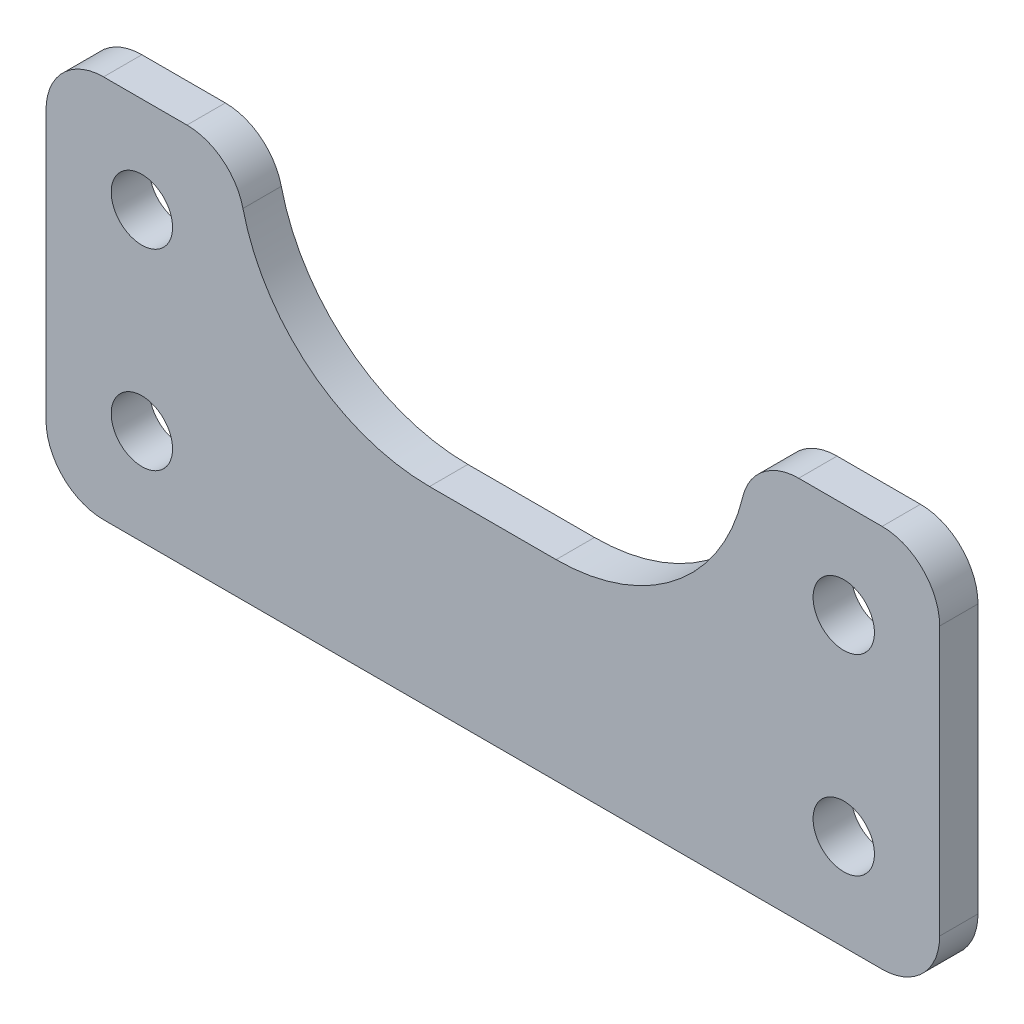
ISO-10303-21;
HEADER;
FILE_DESCRIPTION(('STEP AP214'),'2;1');
FILE_NAME('part.step','',(''),(''),'','','');
FILE_SCHEMA(('AUTOMOTIVE_DESIGN { 1 0 10303 214 1 1 1 1 }'));
ENDSEC;
DATA;
#1=APPLICATION_CONTEXT('core data for automotive mechanical design processes');
#2=APPLICATION_PROTOCOL_DEFINITION('international standard','automotive_design',2000,#1);
#3=PRODUCT_CONTEXT('',#1,'mechanical');
#4=PRODUCT('Part','Part','',(#3));
#5=PRODUCT_RELATED_PRODUCT_CATEGORY('part','',(#4));
#6=PRODUCT_DEFINITION_FORMATION('','',#4);
#7=PRODUCT_DEFINITION_CONTEXT('part definition',#1,'design');
#8=PRODUCT_DEFINITION('design','',#6,#7);
#9=PRODUCT_DEFINITION_SHAPE('','',#8);
#10=(LENGTH_UNIT() NAMED_UNIT(*) SI_UNIT(.MILLI.,.METRE.));
#11=(NAMED_UNIT(*) PLANE_ANGLE_UNIT() SI_UNIT($,.RADIAN.));
#12=(NAMED_UNIT(*) SI_UNIT($,.STERADIAN.) SOLID_ANGLE_UNIT());
#13=UNCERTAINTY_MEASURE_WITH_UNIT(LENGTH_MEASURE(1.E-05),#10,'distance_accuracy_value','');
#14=(GEOMETRIC_REPRESENTATION_CONTEXT(3) GLOBAL_UNCERTAINTY_ASSIGNED_CONTEXT((#13)) GLOBAL_UNIT_ASSIGNED_CONTEXT((#10,
#11,#12)) REPRESENTATION_CONTEXT('',''));
#15=CARTESIAN_POINT('',(0.,0.,0.));
#16=DIRECTION('',(0.,0.,1.));
#17=DIRECTION('',(1.,0.,0.));
#18=AXIS2_PLACEMENT_3D('',#15,#16,#17);
#19=CARTESIAN_POINT('',(0.,20.,2.));
#20=DIRECTION('',(0.,1.,0.));
#21=DIRECTION('',(0.,0.,1.));
#22=AXIS2_PLACEMENT_3D('',#19,#20,#21);
#23=PLANE('',#22);
#24=DIRECTION('',(1.,0.,0.));
#25=VECTOR('',#24,1.);
#26=CARTESIAN_POINT('',(0.,20.,2.));
#27=LINE('',#26,#25);
#28=CARTESIAN_POINT('',(39.2491106406735,20.,2.));
#29=VERTEX_POINT('',#28);
#30=CARTESIAN_POINT('',(43.6,20.,2.));
#31=VERTEX_POINT('',#30);
#32=EDGE_CURVE('E225',#29,#31,#27,.T.);
#33=ORIENTED_EDGE('',*,*,#32,.T.);
#34=DIRECTION('',(0.,0.,-1.));
#35=VECTOR('',#34,1.);
#36=CARTESIAN_POINT('',(43.6,20.,0.));
#37=LINE('',#36,#35);
#38=CARTESIAN_POINT('',(43.6,20.,0.));
#39=VERTEX_POINT('',#38);
#40=EDGE_CURVE('E295',#31,#39,#37,.T.);
#41=ORIENTED_EDGE('',*,*,#40,.T.);
#42=DIRECTION('',(1.,0.,0.));
#43=VECTOR('',#42,1.);
#44=CARTESIAN_POINT('',(0.,20.,0.));
#45=LINE('',#44,#43);
#46=CARTESIAN_POINT('',(39.2491106406735,20.,0.));
#47=VERTEX_POINT('',#46);
#48=EDGE_CURVE('E165',#47,#39,#45,.T.);
#49=ORIENTED_EDGE('',*,*,#48,.F.);
#50=DIRECTION('',(0.,0.,1.));
#51=VECTOR('',#50,1.);
#52=CARTESIAN_POINT('',(39.2491106406735,20.,2.));
#53=LINE('',#52,#51);
#54=EDGE_CURVE('E294',#47,#29,#53,.T.);
#55=ORIENTED_EDGE('',*,*,#54,.T.);
#56=EDGE_LOOP('',(#33,#41,#49,#55));
#57=FACE_BOUND('',#56,.T.);
#58=ADVANCED_FACE('F39',(#57),#23,.T.);
#59=CARTESIAN_POINT('',(0.,10.,2.));
#60=DIRECTION('',(0.,1.,0.));
#61=DIRECTION('',(-1.,0.,0.));
#62=AXIS2_PLACEMENT_3D('',#59,#60,#61);
#63=PLANE('',#62);
#64=DIRECTION('',(1.,0.,0.));
#65=VECTOR('',#64,1.);
#66=CARTESIAN_POINT('',(0.,10.,2.));
#67=LINE('',#66,#65);
#68=CARTESIAN_POINT('',(20.,10.,2.));
#69=VERTEX_POINT('',#68);
#70=CARTESIAN_POINT('',(26.6,10.,2.));
#71=VERTEX_POINT('',#70);
#72=EDGE_CURVE('E224',#69,#71,#67,.T.);
#73=ORIENTED_EDGE('',*,*,#72,.T.);
#74=DIRECTION('',(0.,0.,-1.));
#75=VECTOR('',#74,1.);
#76=CARTESIAN_POINT('',(26.6,10.,2.));
#77=LINE('',#76,#75);
#78=CARTESIAN_POINT('',(26.6,10.,0.));
#79=VERTEX_POINT('',#78);
#80=EDGE_CURVE('E163',#71,#79,#77,.T.);
#81=ORIENTED_EDGE('',*,*,#80,.T.);
#82=DIRECTION('',(1.,0.,0.));
#83=VECTOR('',#82,1.);
#84=CARTESIAN_POINT('',(0.,10.,0.));
#85=LINE('',#84,#83);
#86=CARTESIAN_POINT('',(20.,10.,0.));
#87=VERTEX_POINT('',#86);
#88=EDGE_CURVE('E147',#87,#79,#85,.T.);
#89=ORIENTED_EDGE('',*,*,#88,.F.);
#90=DIRECTION('',(0.,0.,-1.));
#91=VECTOR('',#90,1.);
#92=CARTESIAN_POINT('',(20.,10.,2.));
#93=LINE('',#92,#91);
#94=EDGE_CURVE('E160',#87,#69,#93,.F.);
#95=ORIENTED_EDGE('',*,*,#94,.T.);
#96=EDGE_LOOP('',(#73,#81,#89,#95));
#97=FACE_BOUND('',#96,.T.);
#98=ADVANCED_FACE('F159',(#97),#63,.T.);
#99=CARTESIAN_POINT('',(3.,20.,0.));
#100=VERTEX_POINT('',#99);
#101=CARTESIAN_POINT('',(7.35088935932648,20.,0.));
#102=VERTEX_POINT('',#101);
#103=EDGE_CURVE('E164',#100,#102,#45,.T.);
#104=ORIENTED_EDGE('',*,*,#103,.F.);
#105=DIRECTION('',(0.,0.,-1.));
#106=VECTOR('',#105,1.);
#107=CARTESIAN_POINT('',(3.,20.,2.));
#108=LINE('',#107,#106);
#109=CARTESIAN_POINT('',(3.,20.,2.));
#110=VERTEX_POINT('',#109);
#111=EDGE_CURVE('E47',#100,#110,#108,.F.);
#112=ORIENTED_EDGE('',*,*,#111,.T.);
#113=CARTESIAN_POINT('',(7.35088935932648,20.,2.));
#114=VERTEX_POINT('',#113);
#115=EDGE_CURVE('E219',#110,#114,#27,.T.);
#116=ORIENTED_EDGE('',*,*,#115,.T.);
#117=DIRECTION('',(0.,0.,-1.));
#118=VECTOR('',#117,1.);
#119=CARTESIAN_POINT('',(7.35088935932648,20.,0.));
#120=LINE('',#119,#118);
#121=EDGE_CURVE('E303',#114,#102,#120,.T.);
#122=ORIENTED_EDGE('',*,*,#121,.T.);
#123=EDGE_LOOP('',(#104,#112,#116,#122));
#124=FACE_BOUND('',#123,.T.);
#125=ADVANCED_FACE('F309',(#124),#23,.T.);
#126=CARTESIAN_POINT('',(0.,0.,2.));
#127=DIRECTION('',(-1.,0.,0.));
#128=DIRECTION('',(0.,0.,1.));
#129=AXIS2_PLACEMENT_3D('',#126,#127,#128);
#130=PLANE('',#129);
#131=DIRECTION('',(0.,1.,0.));
#132=VECTOR('',#131,1.);
#133=CARTESIAN_POINT('',(0.,0.,0.));
#134=LINE('',#133,#132);
#135=CARTESIAN_POINT('',(0.,3.,0.));
#136=VERTEX_POINT('',#135);
#137=CARTESIAN_POINT('',(0.,17.,0.));
#138=VERTEX_POINT('',#137);
#139=EDGE_CURVE('E318',#136,#138,#134,.T.);
#140=ORIENTED_EDGE('',*,*,#139,.F.);
#141=DIRECTION('',(0.,0.,-1.));
#142=VECTOR('',#141,1.);
#143=CARTESIAN_POINT('',(0.,3.,2.));
#144=LINE('',#143,#142);
#145=CARTESIAN_POINT('',(0.,3.,2.));
#146=VERTEX_POINT('',#145);
#147=EDGE_CURVE('E203',#136,#146,#144,.F.);
#148=ORIENTED_EDGE('',*,*,#147,.T.);
#149=DIRECTION('',(0.,1.,0.));
#150=VECTOR('',#149,1.);
#151=CARTESIAN_POINT('',(0.,0.,2.));
#152=LINE('',#151,#150);
#153=CARTESIAN_POINT('',(0.,17.,2.));
#154=VERTEX_POINT('',#153);
#155=EDGE_CURVE('E223',#146,#154,#152,.T.);
#156=ORIENTED_EDGE('',*,*,#155,.T.);
#157=DIRECTION('',(0.,0.,-1.));
#158=VECTOR('',#157,1.);
#159=CARTESIAN_POINT('',(0.,17.,2.));
#160=LINE('',#159,#158);
#161=EDGE_CURVE('E200',#154,#138,#160,.T.);
#162=ORIENTED_EDGE('',*,*,#161,.T.);
#163=EDGE_LOOP('',(#140,#148,#156,#162));
#164=FACE_BOUND('',#163,.T.);
#165=ADVANCED_FACE('F317',(#164),#130,.T.);
#166=CARTESIAN_POINT('',(0.,0.,2.));
#167=DIRECTION('',(0.,1.,0.));
#168=DIRECTION('',(0.,0.,1.));
#169=AXIS2_PLACEMENT_3D('',#166,#167,#168);
#170=PLANE('',#169);
#171=DIRECTION('',(1.,0.,0.));
#172=VECTOR('',#171,1.);
#173=CARTESIAN_POINT('',(0.,0.,2.));
#174=LINE('',#173,#172);
#175=CARTESIAN_POINT('',(3.,0.,2.));
#176=VERTEX_POINT('',#175);
#177=CARTESIAN_POINT('',(43.6,0.,2.));
#178=VERTEX_POINT('',#177);
#179=EDGE_CURVE('E257',#176,#178,#174,.T.);
#180=ORIENTED_EDGE('',*,*,#179,.F.);
#181=DIRECTION('',(0.,0.,-1.));
#182=VECTOR('',#181,1.);
#183=CARTESIAN_POINT('',(3.,0.,0.));
#184=LINE('',#183,#182);
#185=CARTESIAN_POINT('',(3.,0.,0.));
#186=VERTEX_POINT('',#185);
#187=EDGE_CURVE('E186',#176,#186,#184,.T.);
#188=ORIENTED_EDGE('',*,*,#187,.T.);
#189=DIRECTION('',(1.,0.,0.));
#190=VECTOR('',#189,1.);
#191=CARTESIAN_POINT('',(0.,0.,0.));
#192=LINE('',#191,#190);
#193=CARTESIAN_POINT('',(43.6,0.,0.));
#194=VERTEX_POINT('',#193);
#195=EDGE_CURVE('E320',#186,#194,#192,.T.);
#196=ORIENTED_EDGE('',*,*,#195,.T.);
#197=DIRECTION('',(0.,0.,-1.));
#198=VECTOR('',#197,1.);
#199=CARTESIAN_POINT('',(43.6,0.,2.));
#200=LINE('',#199,#198);
#201=EDGE_CURVE('E184',#194,#178,#200,.F.);
#202=ORIENTED_EDGE('',*,*,#201,.T.);
#203=EDGE_LOOP('',(#180,#188,#196,#202));
#204=FACE_BOUND('',#203,.T.);
#205=ADVANCED_FACE('F362',(#204),#170,.F.);
#206=CARTESIAN_POINT('',(46.6,0.,2.));
#207=DIRECTION('',(-1.,0.,0.));
#208=DIRECTION('',(0.,0.,1.));
#209=AXIS2_PLACEMENT_3D('',#206,#207,#208);
#210=PLANE('',#209);
#211=DIRECTION('',(0.,1.,0.));
#212=VECTOR('',#211,1.);
#213=CARTESIAN_POINT('',(46.6,0.,2.));
#214=LINE('',#213,#212);
#215=CARTESIAN_POINT('',(46.6,3.,2.));
#216=VERTEX_POINT('',#215);
#217=CARTESIAN_POINT('',(46.6,17.,2.));
#218=VERTEX_POINT('',#217);
#219=EDGE_CURVE('E175',#216,#218,#214,.T.);
#220=ORIENTED_EDGE('',*,*,#219,.F.);
#221=DIRECTION('',(0.,0.,-1.));
#222=VECTOR('',#221,1.);
#223=CARTESIAN_POINT('',(46.6,3.,2.));
#224=LINE('',#223,#222);
#225=CARTESIAN_POINT('',(46.6,3.,0.));
#226=VERTEX_POINT('',#225);
#227=EDGE_CURVE('E292',#216,#226,#224,.T.);
#228=ORIENTED_EDGE('',*,*,#227,.T.);
#229=DIRECTION('',(0.,1.,0.));
#230=VECTOR('',#229,1.);
#231=CARTESIAN_POINT('',(46.6,0.,0.));
#232=LINE('',#231,#230);
#233=CARTESIAN_POINT('',(46.6,17.,0.));
#234=VERTEX_POINT('',#233);
#235=EDGE_CURVE('E323',#226,#234,#232,.T.);
#236=ORIENTED_EDGE('',*,*,#235,.T.);
#237=DIRECTION('',(0.,0.,-1.));
#238=VECTOR('',#237,1.);
#239=CARTESIAN_POINT('',(46.6,17.,2.));
#240=LINE('',#239,#238);
#241=EDGE_CURVE('E54',#234,#218,#240,.F.);
#242=ORIENTED_EDGE('',*,*,#241,.T.);
#243=EDGE_LOOP('',(#220,#228,#236,#242));
#244=FACE_BOUND('',#243,.T.);
#245=ADVANCED_FACE('F387',(#244),#210,.F.);
#246=CARTESIAN_POINT('',(5.,5.,2.));
#247=DIRECTION('',(0.,0.,-1.));
#248=DIRECTION('',(-1.,0.,0.));
#249=AXIS2_PLACEMENT_3D('',#246,#247,#248);
#250=CYLINDRICAL_SURFACE('',#249,1.6);
#251=CARTESIAN_POINT('',(5.,5.,2.));
#252=DIRECTION('',(0.,0.,1.));
#253=DIRECTION('',(1.,0.,0.));
#254=AXIS2_PLACEMENT_3D('',#251,#252,#253);
#255=CIRCLE('',#254,1.6);
#256=CARTESIAN_POINT('',(6.6,5.,2.));
#257=VERTEX_POINT('',#256);
#258=EDGE_CURVE('E226',#257,#257,#255,.T.);
#259=ORIENTED_EDGE('',*,*,#258,.T.);
#260=EDGE_LOOP('',(#259));
#261=FACE_BOUND('',#260,.T.);
#262=CARTESIAN_POINT('',(5.,5.,0.));
#263=DIRECTION('',(0.,0.,1.));
#264=DIRECTION('',(1.,0.,0.));
#265=AXIS2_PLACEMENT_3D('',#262,#263,#264);
#266=CIRCLE('',#265,1.6);
#267=CARTESIAN_POINT('',(6.6,5.,0.));
#268=VERTEX_POINT('',#267);
#269=EDGE_CURVE('E356',#268,#268,#266,.T.);
#270=ORIENTED_EDGE('',*,*,#269,.F.);
#271=EDGE_LOOP('',(#270));
#272=FACE_BOUND('',#271,.T.);
#273=ADVANCED_FACE('F392',(#261,#272),#250,.F.);
#274=CARTESIAN_POINT('',(5.,15.,2.));
#275=DIRECTION('',(0.,0.,-1.));
#276=DIRECTION('',(-1.,0.,0.));
#277=AXIS2_PLACEMENT_3D('',#274,#275,#276);
#278=CYLINDRICAL_SURFACE('',#277,1.6);
#279=CARTESIAN_POINT('',(5.,15.,2.));
#280=DIRECTION('',(0.,0.,1.));
#281=DIRECTION('',(1.,0.,0.));
#282=AXIS2_PLACEMENT_3D('',#279,#280,#281);
#283=CIRCLE('',#282,1.6);
#284=CARTESIAN_POINT('',(6.6,15.,2.));
#285=VERTEX_POINT('',#284);
#286=EDGE_CURVE('E331',#285,#285,#283,.T.);
#287=ORIENTED_EDGE('',*,*,#286,.T.);
#288=EDGE_LOOP('',(#287));
#289=FACE_BOUND('',#288,.T.);
#290=CARTESIAN_POINT('',(5.,15.,0.));
#291=DIRECTION('',(0.,0.,1.));
#292=DIRECTION('',(1.,0.,0.));
#293=AXIS2_PLACEMENT_3D('',#290,#291,#292);
#294=CIRCLE('',#293,1.6);
#295=CARTESIAN_POINT('',(6.6,15.,0.));
#296=VERTEX_POINT('',#295);
#297=EDGE_CURVE('E537',#296,#296,#294,.T.);
#298=ORIENTED_EDGE('',*,*,#297,.F.);
#299=EDGE_LOOP('',(#298));
#300=FACE_BOUND('',#299,.T.);
#301=ADVANCED_FACE('F485',(#289,#300),#278,.F.);
#302=CARTESIAN_POINT('',(41.6,15.,2.));
#303=DIRECTION('',(0.,0.,-1.));
#304=DIRECTION('',(-1.,0.,0.));
#305=AXIS2_PLACEMENT_3D('',#302,#303,#304);
#306=CYLINDRICAL_SURFACE('',#305,1.59999999999999);
#307=CARTESIAN_POINT('',(41.6,15.,2.));
#308=DIRECTION('',(0.,0.,1.));
#309=DIRECTION('',(1.,0.,0.));
#310=AXIS2_PLACEMENT_3D('',#307,#308,#309);
#311=CIRCLE('',#310,1.59999999999999);
#312=CARTESIAN_POINT('',(43.2,15.,2.));
#313=VERTEX_POINT('',#312);
#314=EDGE_CURVE('E327',#313,#313,#311,.F.);
#315=ORIENTED_EDGE('',*,*,#314,.F.);
#316=EDGE_LOOP('',(#315));
#317=FACE_BOUND('',#316,.T.);
#318=CARTESIAN_POINT('',(41.6,15.,0.));
#319=DIRECTION('',(0.,0.,1.));
#320=DIRECTION('',(1.,0.,0.));
#321=AXIS2_PLACEMENT_3D('',#318,#319,#320);
#322=CIRCLE('',#321,1.59999999999999);
#323=CARTESIAN_POINT('',(43.2,15.,0.));
#324=VERTEX_POINT('',#323);
#325=EDGE_CURVE('E540',#324,#324,#322,.F.);
#326=ORIENTED_EDGE('',*,*,#325,.T.);
#327=EDGE_LOOP('',(#326));
#328=FACE_BOUND('',#327,.T.);
#329=ADVANCED_FACE('F396',(#317,#328),#306,.F.);
#330=CARTESIAN_POINT('',(41.6,5.,2.));
#331=DIRECTION('',(0.,0.,-1.));
#332=DIRECTION('',(-1.,0.,0.));
#333=AXIS2_PLACEMENT_3D('',#330,#331,#332);
#334=CYLINDRICAL_SURFACE('',#333,1.59999999999999);
#335=CARTESIAN_POINT('',(41.6,5.,2.));
#336=DIRECTION('',(0.,0.,1.));
#337=DIRECTION('',(1.,0.,0.));
#338=AXIS2_PLACEMENT_3D('',#335,#336,#337);
#339=CIRCLE('',#338,1.59999999999999);
#340=CARTESIAN_POINT('',(43.2,5.,2.));
#341=VERTEX_POINT('',#340);
#342=EDGE_CURVE('E170',#341,#341,#339,.F.);
#343=ORIENTED_EDGE('',*,*,#342,.F.);
#344=EDGE_LOOP('',(#343));
#345=FACE_BOUND('',#344,.T.);
#346=CARTESIAN_POINT('',(41.6,5.,0.));
#347=DIRECTION('',(0.,0.,1.));
#348=DIRECTION('',(1.,0.,0.));
#349=AXIS2_PLACEMENT_3D('',#346,#347,#348);
#350=CIRCLE('',#349,1.59999999999999);
#351=CARTESIAN_POINT('',(43.2,5.,0.));
#352=VERTEX_POINT('',#351);
#353=EDGE_CURVE('E178',#352,#352,#350,.F.);
#354=ORIENTED_EDGE('',*,*,#353,.T.);
#355=EDGE_LOOP('',(#354));
#356=FACE_BOUND('',#355,.T.);
#357=ADVANCED_FACE('F393',(#345,#356),#334,.F.);
#358=CARTESIAN_POINT('',(0.,0.,2.));
#359=DIRECTION('',(0.,0.,1.));
#360=DIRECTION('',(1.,0.,0.));
#361=AXIS2_PLACEMENT_3D('',#358,#359,#360);
#362=PLANE('',#361);
#363=ORIENTED_EDGE('',*,*,#314,.T.);
#364=EDGE_LOOP('',(#363));
#365=FACE_BOUND('',#364,.T.);
#366=ORIENTED_EDGE('',*,*,#286,.F.);
#367=EDGE_LOOP('',(#366));
#368=FACE_BOUND('',#367,.T.);
#369=ORIENTED_EDGE('',*,*,#258,.F.);
#370=EDGE_LOOP('',(#369));
#371=FACE_BOUND('',#370,.T.);
#372=ORIENTED_EDGE('',*,*,#155,.F.);
#373=CARTESIAN_POINT('',(3.,3.,2.));
#374=DIRECTION('',(0.,0.,1.));
#375=DIRECTION('',(1.,0.,0.));
#376=AXIS2_PLACEMENT_3D('',#373,#374,#375);
#377=CIRCLE('',#376,3.);
#378=EDGE_CURVE('E266',#146,#176,#377,.T.);
#379=ORIENTED_EDGE('',*,*,#378,.T.);
#380=ORIENTED_EDGE('',*,*,#179,.T.);
#381=CARTESIAN_POINT('',(43.6,3.,2.));
#382=DIRECTION('',(0.,0.,1.));
#383=DIRECTION('',(1.,0.,0.));
#384=AXIS2_PLACEMENT_3D('',#381,#382,#383);
#385=CIRCLE('',#384,3.);
#386=EDGE_CURVE('E61',#178,#216,#385,.T.);
#387=ORIENTED_EDGE('',*,*,#386,.T.);
#388=ORIENTED_EDGE('',*,*,#219,.T.);
#389=CARTESIAN_POINT('',(43.6,17.,2.));
#390=DIRECTION('',(0.,0.,1.));
#391=DIRECTION('',(1.,0.,0.));
#392=AXIS2_PLACEMENT_3D('',#389,#390,#391);
#393=CIRCLE('',#392,3.);
#394=EDGE_CURVE('E244',#218,#31,#393,.T.);
#395=ORIENTED_EDGE('',*,*,#394,.T.);
#396=ORIENTED_EDGE('',*,*,#32,.F.);
#397=CARTESIAN_POINT('',(39.2491106406735,17.,2.));
#398=DIRECTION('',(0.,0.,1.));
#399=DIRECTION('',(1.,0.,0.));
#400=AXIS2_PLACEMENT_3D('',#397,#398,#399);
#401=CIRCLE('',#400,3.);
#402=CARTESIAN_POINT('',(36.3300851082104,17.6923076923077,2.));
#403=VERTEX_POINT('',#402);
#404=EDGE_CURVE('E242',#29,#403,#401,.T.);
#405=ORIENTED_EDGE('',*,*,#404,.T.);
#406=CARTESIAN_POINT('',(26.6,20.,2.));
#407=DIRECTION('',(0.,0.,1.));
#408=DIRECTION('',(1.,0.,0.));
#409=AXIS2_PLACEMENT_3D('',#406,#407,#408);
#410=CIRCLE('',#409,10.);
#411=EDGE_CURVE('E154',#403,#71,#410,.F.);
#412=ORIENTED_EDGE('',*,*,#411,.T.);
#413=ORIENTED_EDGE('',*,*,#72,.F.);
#414=CARTESIAN_POINT('',(20.,20.,2.));
#415=DIRECTION('',(0.,0.,1.));
#416=DIRECTION('',(1.,0.,0.));
#417=AXIS2_PLACEMENT_3D('',#414,#415,#416);
#418=CIRCLE('',#417,10.);
#419=CARTESIAN_POINT('',(10.2699148917896,17.6923076923077,2.));
#420=VERTEX_POINT('',#419);
#421=EDGE_CURVE('E153',#69,#420,#418,.F.);
#422=ORIENTED_EDGE('',*,*,#421,.T.);
#423=CARTESIAN_POINT('',(7.35088935932648,17.,2.));
#424=DIRECTION('',(0.,0.,1.));
#425=DIRECTION('',(1.,0.,0.));
#426=AXIS2_PLACEMENT_3D('',#423,#424,#425);
#427=CIRCLE('',#426,3.);
#428=EDGE_CURVE('E205',#420,#114,#427,.T.);
#429=ORIENTED_EDGE('',*,*,#428,.T.);
#430=ORIENTED_EDGE('',*,*,#115,.F.);
#431=CARTESIAN_POINT('',(3.,17.,2.));
#432=DIRECTION('',(0.,0.,1.));
#433=DIRECTION('',(1.,0.,0.));
#434=AXIS2_PLACEMENT_3D('',#431,#432,#433);
#435=CIRCLE('',#434,3.);
#436=EDGE_CURVE('E207',#110,#154,#435,.T.);
#437=ORIENTED_EDGE('',*,*,#436,.T.);
#438=EDGE_LOOP('',(#372,#379,#380,#387,#388,#395,#396,#405,#412,#413,#422,#429,#430,#437));
#439=FACE_BOUND('',#438,.T.);
#440=ORIENTED_EDGE('',*,*,#342,.T.);
#441=EDGE_LOOP('',(#440));
#442=FACE_BOUND('',#441,.T.);
#443=ADVANCED_FACE('F282',(#365,#368,#371,#439,#442),#362,.T.);
#444=CARTESIAN_POINT('',(0.,0.,0.));
#445=DIRECTION('',(0.,0.,1.));
#446=DIRECTION('',(1.,0.,0.));
#447=AXIS2_PLACEMENT_3D('',#444,#445,#446);
#448=PLANE('',#447);
#449=ORIENTED_EDGE('',*,*,#325,.F.);
#450=EDGE_LOOP('',(#449));
#451=FACE_BOUND('',#450,.T.);
#452=ORIENTED_EDGE('',*,*,#297,.T.);
#453=EDGE_LOOP('',(#452));
#454=FACE_BOUND('',#453,.T.);
#455=ORIENTED_EDGE('',*,*,#269,.T.);
#456=EDGE_LOOP('',(#455));
#457=FACE_BOUND('',#456,.T.);
#458=ORIENTED_EDGE('',*,*,#195,.F.);
#459=CARTESIAN_POINT('',(3.,3.,0.));
#460=DIRECTION('',(0.,0.,1.));
#461=DIRECTION('',(1.,0.,0.));
#462=AXIS2_PLACEMENT_3D('',#459,#460,#461);
#463=CIRCLE('',#462,3.);
#464=EDGE_CURVE('E198',#186,#136,#463,.F.);
#465=ORIENTED_EDGE('',*,*,#464,.T.);
#466=ORIENTED_EDGE('',*,*,#139,.T.);
#467=CARTESIAN_POINT('',(3.,17.,0.));
#468=DIRECTION('',(0.,0.,1.));
#469=DIRECTION('',(1.,0.,0.));
#470=AXIS2_PLACEMENT_3D('',#467,#468,#469);
#471=CIRCLE('',#470,3.);
#472=EDGE_CURVE('E190',#138,#100,#471,.F.);
#473=ORIENTED_EDGE('',*,*,#472,.T.);
#474=ORIENTED_EDGE('',*,*,#103,.T.);
#475=CARTESIAN_POINT('',(7.35088935932648,17.,0.));
#476=DIRECTION('',(0.,0.,1.));
#477=DIRECTION('',(1.,0.,0.));
#478=AXIS2_PLACEMENT_3D('',#475,#476,#477);
#479=CIRCLE('',#478,3.);
#480=CARTESIAN_POINT('',(10.2699148917896,17.6923076923077,0.));
#481=VERTEX_POINT('',#480);
#482=EDGE_CURVE('E149',#102,#481,#479,.F.);
#483=ORIENTED_EDGE('',*,*,#482,.T.);
#484=CARTESIAN_POINT('',(20.,20.,0.));
#485=DIRECTION('',(0.,0.,1.));
#486=DIRECTION('',(1.,0.,0.));
#487=AXIS2_PLACEMENT_3D('',#484,#485,#486);
#488=CIRCLE('',#487,10.);
#489=EDGE_CURVE('E141',#481,#87,#488,.T.);
#490=ORIENTED_EDGE('',*,*,#489,.T.);
#491=ORIENTED_EDGE('',*,*,#88,.T.);
#492=CARTESIAN_POINT('',(26.6,20.,0.));
#493=DIRECTION('',(0.,0.,1.));
#494=DIRECTION('',(1.,0.,0.));
#495=AXIS2_PLACEMENT_3D('',#492,#493,#494);
#496=CIRCLE('',#495,10.);
#497=CARTESIAN_POINT('',(36.3300851082104,17.6923076923077,0.));
#498=VERTEX_POINT('',#497);
#499=EDGE_CURVE('E172',#79,#498,#496,.T.);
#500=ORIENTED_EDGE('',*,*,#499,.T.);
#501=CARTESIAN_POINT('',(39.2491106406735,17.,0.));
#502=DIRECTION('',(0.,0.,1.));
#503=DIRECTION('',(1.,0.,0.));
#504=AXIS2_PLACEMENT_3D('',#501,#502,#503);
#505=CIRCLE('',#504,3.);
#506=EDGE_CURVE('E192',#498,#47,#505,.F.);
#507=ORIENTED_EDGE('',*,*,#506,.T.);
#508=ORIENTED_EDGE('',*,*,#48,.T.);
#509=CARTESIAN_POINT('',(43.6,17.,0.));
#510=DIRECTION('',(0.,0.,1.));
#511=DIRECTION('',(1.,0.,0.));
#512=AXIS2_PLACEMENT_3D('',#509,#510,#511);
#513=CIRCLE('',#512,3.);
#514=EDGE_CURVE('E194',#39,#234,#513,.F.);
#515=ORIENTED_EDGE('',*,*,#514,.T.);
#516=ORIENTED_EDGE('',*,*,#235,.F.);
#517=CARTESIAN_POINT('',(43.6,3.,0.));
#518=DIRECTION('',(0.,0.,1.));
#519=DIRECTION('',(1.,0.,0.));
#520=AXIS2_PLACEMENT_3D('',#517,#518,#519);
#521=CIRCLE('',#520,3.);
#522=EDGE_CURVE('E196',#226,#194,#521,.F.);
#523=ORIENTED_EDGE('',*,*,#522,.T.);
#524=EDGE_LOOP('',(#458,#465,#466,#473,#474,#483,#490,#491,#500,#507,#508,#515,#516,#523));
#525=FACE_BOUND('',#524,.T.);
#526=ORIENTED_EDGE('',*,*,#353,.F.);
#527=EDGE_LOOP('',(#526));
#528=FACE_BOUND('',#527,.T.);
#529=ADVANCED_FACE('F144',(#451,#454,#457,#525,#528),#448,.F.);
#530=CARTESIAN_POINT('',(26.6,20.,2.));
#531=DIRECTION('',(0.,0.,-1.));
#532=DIRECTION('',(-1.,0.,0.));
#533=AXIS2_PLACEMENT_3D('',#530,#531,#532);
#534=CYLINDRICAL_SURFACE('',#533,10.);
#535=ORIENTED_EDGE('',*,*,#411,.F.);
#536=DIRECTION('',(0.,0.,-1.));
#537=VECTOR('',#536,1.);
#538=CARTESIAN_POINT('',(36.3300851082104,17.6923076923077,2.));
#539=LINE('',#538,#537);
#540=EDGE_CURVE('E300',#403,#498,#539,.T.);
#541=ORIENTED_EDGE('',*,*,#540,.T.);
#542=ORIENTED_EDGE('',*,*,#499,.F.);
#543=ORIENTED_EDGE('',*,*,#80,.F.);
#544=EDGE_LOOP('',(#535,#541,#542,#543));
#545=FACE_BOUND('',#544,.T.);
#546=ADVANCED_FACE('F350',(#545),#534,.F.);
#547=CARTESIAN_POINT('',(20.,20.,2.));
#548=DIRECTION('',(0.,0.,1.));
#549=DIRECTION('',(1.,0.,0.));
#550=AXIS2_PLACEMENT_3D('',#547,#548,#549);
#551=CYLINDRICAL_SURFACE('',#550,10.);
#552=ORIENTED_EDGE('',*,*,#489,.F.);
#553=DIRECTION('',(0.,0.,1.));
#554=VECTOR('',#553,1.);
#555=CARTESIAN_POINT('',(10.2699148917896,17.6923076923077,2.));
#556=LINE('',#555,#554);
#557=EDGE_CURVE('E12',#481,#420,#556,.T.);
#558=ORIENTED_EDGE('',*,*,#557,.T.);
#559=ORIENTED_EDGE('',*,*,#421,.F.);
#560=ORIENTED_EDGE('',*,*,#94,.F.);
#561=EDGE_LOOP('',(#552,#558,#559,#560));
#562=FACE_BOUND('',#561,.T.);
#563=ADVANCED_FACE('F168',(#562),#551,.F.);
#564=CARTESIAN_POINT('',(3.,3.,2.));
#565=DIRECTION('',(0.,0.,1.));
#566=DIRECTION('',(1.,0.,0.));
#567=AXIS2_PLACEMENT_3D('',#564,#565,#566);
#568=CYLINDRICAL_SURFACE('',#567,3.);
#569=ORIENTED_EDGE('',*,*,#378,.F.);
#570=ORIENTED_EDGE('',*,*,#147,.F.);
#571=ORIENTED_EDGE('',*,*,#464,.F.);
#572=ORIENTED_EDGE('',*,*,#187,.F.);
#573=EDGE_LOOP('',(#569,#570,#571,#572));
#574=FACE_BOUND('',#573,.T.);
#575=ADVANCED_FACE('F364',(#574),#568,.T.);
#576=CARTESIAN_POINT('',(43.6,3.,2.));
#577=DIRECTION('',(0.,0.,-1.));
#578=DIRECTION('',(-1.,0.,0.));
#579=AXIS2_PLACEMENT_3D('',#576,#577,#578);
#580=CYLINDRICAL_SURFACE('',#579,3.);
#581=ORIENTED_EDGE('',*,*,#386,.F.);
#582=ORIENTED_EDGE('',*,*,#201,.F.);
#583=ORIENTED_EDGE('',*,*,#522,.F.);
#584=ORIENTED_EDGE('',*,*,#227,.F.);
#585=EDGE_LOOP('',(#581,#582,#583,#584));
#586=FACE_BOUND('',#585,.T.);
#587=ADVANCED_FACE('F290',(#586),#580,.T.);
#588=CARTESIAN_POINT('',(43.6,17.,2.));
#589=DIRECTION('',(0.,0.,1.));
#590=DIRECTION('',(1.,0.,0.));
#591=AXIS2_PLACEMENT_3D('',#588,#589,#590);
#592=CYLINDRICAL_SURFACE('',#591,3.);
#593=ORIENTED_EDGE('',*,*,#394,.F.);
#594=ORIENTED_EDGE('',*,*,#241,.F.);
#595=ORIENTED_EDGE('',*,*,#514,.F.);
#596=ORIENTED_EDGE('',*,*,#40,.F.);
#597=EDGE_LOOP('',(#593,#594,#595,#596));
#598=FACE_BOUND('',#597,.T.);
#599=ADVANCED_FACE('F361',(#598),#592,.T.);
#600=CARTESIAN_POINT('',(39.2491106406735,17.,2.));
#601=DIRECTION('',(0.,0.,-1.));
#602=DIRECTION('',(-1.,0.,0.));
#603=AXIS2_PLACEMENT_3D('',#600,#601,#602);
#604=CYLINDRICAL_SURFACE('',#603,3.);
#605=ORIENTED_EDGE('',*,*,#404,.F.);
#606=ORIENTED_EDGE('',*,*,#54,.F.);
#607=ORIENTED_EDGE('',*,*,#506,.F.);
#608=ORIENTED_EDGE('',*,*,#540,.F.);
#609=EDGE_LOOP('',(#605,#606,#607,#608));
#610=FACE_BOUND('',#609,.T.);
#611=ADVANCED_FACE('F358',(#610),#604,.T.);
#612=CARTESIAN_POINT('',(3.,17.,2.));
#613=DIRECTION('',(0.,0.,-1.));
#614=DIRECTION('',(-1.,0.,0.));
#615=AXIS2_PLACEMENT_3D('',#612,#613,#614);
#616=CYLINDRICAL_SURFACE('',#615,3.);
#617=ORIENTED_EDGE('',*,*,#436,.F.);
#618=ORIENTED_EDGE('',*,*,#111,.F.);
#619=ORIENTED_EDGE('',*,*,#472,.F.);
#620=ORIENTED_EDGE('',*,*,#161,.F.);
#621=EDGE_LOOP('',(#617,#618,#619,#620));
#622=FACE_BOUND('',#621,.T.);
#623=ADVANCED_FACE('F314',(#622),#616,.T.);
#624=CARTESIAN_POINT('',(7.35088935932648,17.,2.));
#625=DIRECTION('',(0.,0.,1.));
#626=DIRECTION('',(1.,0.,0.));
#627=AXIS2_PLACEMENT_3D('',#624,#625,#626);
#628=CYLINDRICAL_SURFACE('',#627,3.);
#629=ORIENTED_EDGE('',*,*,#428,.F.);
#630=ORIENTED_EDGE('',*,*,#557,.F.);
#631=ORIENTED_EDGE('',*,*,#482,.F.);
#632=ORIENTED_EDGE('',*,*,#121,.F.);
#633=EDGE_LOOP('',(#629,#630,#631,#632));
#634=FACE_BOUND('',#633,.T.);
#635=ADVANCED_FACE('F41',(#634),#628,.T.);
#636=CLOSED_SHELL('',(#58,#98,#125,#165,#205,#245,#273,#301,#329,#357,#443,#529,#546,#563,#575,
#587,#599,#611,#623,#635));
#637=MANIFOLD_SOLID_BREP('B2',#636);
#638=ADVANCED_BREP_SHAPE_REPRESENTATION('',(#18,#637),#14);
#639=SHAPE_DEFINITION_REPRESENTATION(#9,#638);
ENDSEC;
END-ISO-10303-21;
